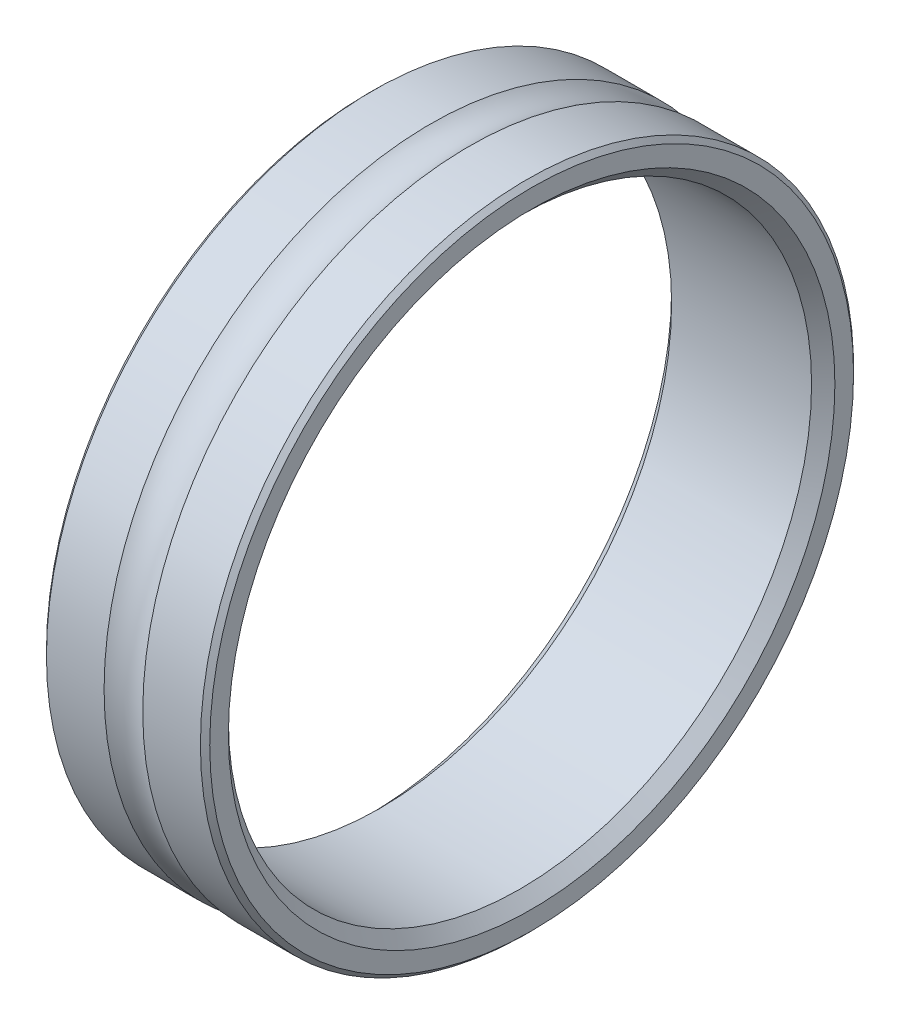
ISO-10303-21;
HEADER;
FILE_DESCRIPTION(('STEP AP214'),'2;1');
FILE_NAME('part.step','',(''),(''),'','','');
FILE_SCHEMA(('AUTOMOTIVE_DESIGN { 1 0 10303 214 1 1 1 1 }'));
ENDSEC;
DATA;
#1=APPLICATION_CONTEXT('core data for automotive mechanical design processes');
#2=APPLICATION_PROTOCOL_DEFINITION('international standard','automotive_design',2000,#1);
#3=PRODUCT_CONTEXT('',#1,'mechanical');
#4=PRODUCT('Part','Part','',(#3));
#5=PRODUCT_RELATED_PRODUCT_CATEGORY('part','',(#4));
#6=PRODUCT_DEFINITION_FORMATION('','',#4);
#7=PRODUCT_DEFINITION_CONTEXT('part definition',#1,'design');
#8=PRODUCT_DEFINITION('design','',#6,#7);
#9=PRODUCT_DEFINITION_SHAPE('','',#8);
#10=(LENGTH_UNIT() NAMED_UNIT(*) SI_UNIT(.MILLI.,.METRE.));
#11=(NAMED_UNIT(*) PLANE_ANGLE_UNIT() SI_UNIT($,.RADIAN.));
#12=(NAMED_UNIT(*) SI_UNIT($,.STERADIAN.) SOLID_ANGLE_UNIT());
#13=UNCERTAINTY_MEASURE_WITH_UNIT(LENGTH_MEASURE(1.E-05),#10,'distance_accuracy_value','');
#14=(GEOMETRIC_REPRESENTATION_CONTEXT(3) GLOBAL_UNCERTAINTY_ASSIGNED_CONTEXT((#13)) GLOBAL_UNIT_ASSIGNED_CONTEXT((#10,
#11,#12)) REPRESENTATION_CONTEXT('',''));
#15=CARTESIAN_POINT('',(0.,0.,0.));
#16=DIRECTION('',(0.,0.,1.));
#17=DIRECTION('',(1.,0.,0.));
#18=AXIS2_PLACEMENT_3D('',#15,#16,#17);
#19=CARTESIAN_POINT('',(-3.5,12.5,0.));
#20=DIRECTION('',(1.,0.,0.));
#21=DIRECTION('',(0.,0.,-1.));
#22=AXIS2_PLACEMENT_3D('',#19,#20,#21);
#23=PLANE('',#22);
#24=CARTESIAN_POINT('',(-3.5,0.,0.));
#25=DIRECTION('',(1.,0.,0.));
#26=DIRECTION('',(0.,0.,-1.));
#27=AXIS2_PLACEMENT_3D('',#24,#25,#26);
#28=CIRCLE('',#27,13.8);
#29=CARTESIAN_POINT('',(-3.5,0.,-13.8));
#30=VERTEX_POINT('',#29);
#31=EDGE_CURVE('E47',#30,#30,#28,.F.);
#32=ORIENTED_EDGE('',*,*,#31,.T.);
#33=EDGE_LOOP('',(#32));
#34=FACE_BOUND('',#33,.T.);
#35=CARTESIAN_POINT('',(-3.5,0.,0.));
#36=DIRECTION('',(1.,0.,0.));
#37=DIRECTION('',(0.,0.,-1.));
#38=AXIS2_PLACEMENT_3D('',#35,#36,#37);
#39=CIRCLE('',#38,13.);
#40=CARTESIAN_POINT('',(-3.5,0.,-13.));
#41=VERTEX_POINT('',#40);
#42=EDGE_CURVE('E55',#41,#41,#39,.T.);
#43=ORIENTED_EDGE('',*,*,#42,.T.);
#44=EDGE_LOOP('',(#43));
#45=FACE_BOUND('',#44,.T.);
#46=ADVANCED_FACE('F32',(#34,#45),#23,.F.);
#47=CARTESIAN_POINT('',(0.,0.,0.));
#48=DIRECTION('',(-1.,0.,0.));
#49=DIRECTION('',(0.,0.,1.));
#50=AXIS2_PLACEMENT_3D('',#47,#48,#49);
#51=CYLINDRICAL_SURFACE('',#50,12.5);
#52=CARTESIAN_POINT('',(-3.,0.,0.));
#53=DIRECTION('',(1.,0.,0.));
#54=DIRECTION('',(0.,0.,-1.));
#55=AXIS2_PLACEMENT_3D('',#52,#53,#54);
#56=CIRCLE('',#55,12.5);
#57=CARTESIAN_POINT('',(-3.,0.,-12.5));
#58=VERTEX_POINT('',#57);
#59=EDGE_CURVE('E58',#58,#58,#56,.F.);
#60=ORIENTED_EDGE('',*,*,#59,.T.);
#61=EDGE_LOOP('',(#60));
#62=FACE_BOUND('',#61,.T.);
#63=CARTESIAN_POINT('',(3.,0.,0.));
#64=DIRECTION('',(-1.,0.,0.));
#65=DIRECTION('',(0.,0.,1.));
#66=AXIS2_PLACEMENT_3D('',#63,#64,#65);
#67=CIRCLE('',#66,12.5);
#68=CARTESIAN_POINT('',(3.,0.,12.5));
#69=VERTEX_POINT('',#68);
#70=EDGE_CURVE('E61',#69,#69,#67,.F.);
#71=ORIENTED_EDGE('',*,*,#70,.T.);
#72=EDGE_LOOP('',(#71));
#73=FACE_BOUND('',#72,.T.);
#74=ADVANCED_FACE('F86',(#62,#73),#51,.F.);
#75=CARTESIAN_POINT('',(3.5,12.5,0.));
#76=DIRECTION('',(-1.,0.,0.));
#77=DIRECTION('',(0.,0.,1.));
#78=AXIS2_PLACEMENT_3D('',#75,#76,#77);
#79=PLANE('',#78);
#80=CARTESIAN_POINT('',(3.5,0.,0.));
#81=DIRECTION('',(-1.,0.,0.));
#82=DIRECTION('',(0.,0.,1.));
#83=AXIS2_PLACEMENT_3D('',#80,#81,#82);
#84=CIRCLE('',#83,13.8);
#85=CARTESIAN_POINT('',(3.5,0.,13.8));
#86=VERTEX_POINT('',#85);
#87=EDGE_CURVE('E10',#86,#86,#84,.F.);
#88=ORIENTED_EDGE('',*,*,#87,.T.);
#89=EDGE_LOOP('',(#88));
#90=FACE_BOUND('',#89,.T.);
#91=CARTESIAN_POINT('',(3.5,0.,0.));
#92=DIRECTION('',(-1.,0.,0.));
#93=DIRECTION('',(0.,0.,1.));
#94=AXIS2_PLACEMENT_3D('',#91,#92,#93);
#95=CIRCLE('',#94,13.);
#96=CARTESIAN_POINT('',(3.5,0.,13.));
#97=VERTEX_POINT('',#96);
#98=EDGE_CURVE('E52',#97,#97,#95,.T.);
#99=ORIENTED_EDGE('',*,*,#98,.T.);
#100=EDGE_LOOP('',(#99));
#101=FACE_BOUND('',#100,.T.);
#102=ADVANCED_FACE('F81',(#90,#101),#79,.F.);
#103=CARTESIAN_POINT('',(0.,0.,0.));
#104=DIRECTION('',(-1.,0.,0.));
#105=DIRECTION('',(0.,0.,1.));
#106=AXIS2_PLACEMENT_3D('',#103,#104,#105);
#107=CYLINDRICAL_SURFACE('',#106,14.);
#108=CARTESIAN_POINT('',(3.3,0.,0.));
#109=DIRECTION('',(-1.,0.,0.));
#110=DIRECTION('',(0.,0.,1.));
#111=AXIS2_PLACEMENT_3D('',#108,#109,#110);
#112=CIRCLE('',#111,14.);
#113=CARTESIAN_POINT('',(3.3,0.,14.));
#114=VERTEX_POINT('',#113);
#115=EDGE_CURVE('E39',#114,#114,#112,.T.);
#116=ORIENTED_EDGE('',*,*,#115,.T.);
#117=EDGE_LOOP('',(#116));
#118=FACE_BOUND('',#117,.T.);
#119=CARTESIAN_POINT('',(0.829156197588851,0.,0.));
#120=DIRECTION('',(-1.,0.,0.));
#121=DIRECTION('',(0.,0.,1.));
#122=AXIS2_PLACEMENT_3D('',#119,#120,#121);
#123=CIRCLE('',#122,14.);
#124=CARTESIAN_POINT('',(0.829156197588851,0.,14.));
#125=VERTEX_POINT('',#124);
#126=EDGE_CURVE('E64',#125,#125,#123,.T.);
#127=ORIENTED_EDGE('',*,*,#126,.F.);
#128=EDGE_LOOP('',(#127));
#129=FACE_BOUND('',#128,.T.);
#130=ADVANCED_FACE('F76',(#118,#129),#107,.T.);
#131=CARTESIAN_POINT('',(0.,0.,0.));
#132=DIRECTION('',(-1.,0.,0.));
#133=DIRECTION('',(0.,0.,1.));
#134=AXIS2_PLACEMENT_3D('',#131,#132,#133);
#135=TOROIDAL_SURFACE('',#134,15.25,1.5);
#136=CARTESIAN_POINT('',(-0.829156197588852,0.,0.));
#137=DIRECTION('',(-1.,0.,0.));
#138=DIRECTION('',(0.,0.,1.));
#139=AXIS2_PLACEMENT_3D('',#136,#137,#138);
#140=CIRCLE('',#139,14.);
#141=CARTESIAN_POINT('',(-0.829156197588852,0.,14.));
#142=VERTEX_POINT('',#141);
#143=EDGE_CURVE('E67',#142,#142,#140,.T.);
#144=ORIENTED_EDGE('',*,*,#143,.F.);
#145=EDGE_LOOP('',(#144));
#146=FACE_BOUND('',#145,.T.);
#147=ORIENTED_EDGE('',*,*,#126,.T.);
#148=EDGE_LOOP('',(#147));
#149=FACE_BOUND('',#148,.T.);
#150=ADVANCED_FACE('F73',(#146,#149),#135,.F.);
#151=CARTESIAN_POINT('',(0.,0.,0.));
#152=DIRECTION('',(-1.,0.,0.));
#153=DIRECTION('',(0.,0.,1.));
#154=AXIS2_PLACEMENT_3D('',#151,#152,#153);
#155=CYLINDRICAL_SURFACE('',#154,14.);
#156=CARTESIAN_POINT('',(-3.3,0.,0.));
#157=DIRECTION('',(1.,0.,0.));
#158=DIRECTION('',(0.,0.,-1.));
#159=AXIS2_PLACEMENT_3D('',#156,#157,#158);
#160=CIRCLE('',#159,14.);
#161=CARTESIAN_POINT('',(-3.3,0.,-14.));
#162=VERTEX_POINT('',#161);
#163=EDGE_CURVE('E43',#162,#162,#160,.T.);
#164=ORIENTED_EDGE('',*,*,#163,.T.);
#165=EDGE_LOOP('',(#164));
#166=FACE_BOUND('',#165,.T.);
#167=ORIENTED_EDGE('',*,*,#143,.T.);
#168=EDGE_LOOP('',(#167));
#169=FACE_BOUND('',#168,.T.);
#170=ADVANCED_FACE('F71',(#166,#169),#155,.T.);
#171=CARTESIAN_POINT('',(-3.,0.,0.));
#172=DIRECTION('',(-1.,0.,0.));
#173=DIRECTION('',(0.,0.,1.));
#174=AXIS2_PLACEMENT_3D('',#171,#172,#173);
#175=CONICAL_SURFACE('',#174,12.5,0.785398163397452);
#176=ORIENTED_EDGE('',*,*,#42,.F.);
#177=EDGE_LOOP('',(#176));
#178=FACE_BOUND('',#177,.T.);
#179=ORIENTED_EDGE('',*,*,#59,.F.);
#180=EDGE_LOOP('',(#179));
#181=FACE_BOUND('',#180,.T.);
#182=ADVANCED_FACE('F98',(#178,#181),#175,.F.);
#183=CARTESIAN_POINT('',(3.5,0.,0.));
#184=DIRECTION('',(1.,0.,0.));
#185=DIRECTION('',(0.,0.,-1.));
#186=AXIS2_PLACEMENT_3D('',#183,#184,#185);
#187=CONICAL_SURFACE('',#186,13.,0.785398163397448);
#188=ORIENTED_EDGE('',*,*,#70,.F.);
#189=EDGE_LOOP('',(#188));
#190=FACE_BOUND('',#189,.T.);
#191=ORIENTED_EDGE('',*,*,#98,.F.);
#192=EDGE_LOOP('',(#191));
#193=FACE_BOUND('',#192,.T.);
#194=ADVANCED_FACE('F101',(#190,#193),#187,.F.);
#195=CARTESIAN_POINT('',(-3.5,0.,0.));
#196=DIRECTION('',(1.,0.,0.));
#197=DIRECTION('',(0.,0.,-1.));
#198=AXIS2_PLACEMENT_3D('',#195,#196,#197);
#199=CONICAL_SURFACE('',#198,13.8,0.785398163397453);
#200=ORIENTED_EDGE('',*,*,#163,.F.);
#201=EDGE_LOOP('',(#200));
#202=FACE_BOUND('',#201,.T.);
#203=ORIENTED_EDGE('',*,*,#31,.F.);
#204=EDGE_LOOP('',(#203));
#205=FACE_BOUND('',#204,.T.);
#206=ADVANCED_FACE('F104',(#202,#205),#199,.T.);
#207=CARTESIAN_POINT('',(3.3,0.,0.));
#208=DIRECTION('',(-1.,0.,0.));
#209=DIRECTION('',(0.,0.,1.));
#210=AXIS2_PLACEMENT_3D('',#207,#208,#209);
#211=CONICAL_SURFACE('',#210,14.,0.785398163397457);
#212=ORIENTED_EDGE('',*,*,#87,.F.);
#213=EDGE_LOOP('',(#212));
#214=FACE_BOUND('',#213,.T.);
#215=ORIENTED_EDGE('',*,*,#115,.F.);
#216=EDGE_LOOP('',(#215));
#217=FACE_BOUND('',#216,.T.);
#218=ADVANCED_FACE('F34',(#214,#217),#211,.T.);
#219=CLOSED_SHELL('',(#46,#74,#102,#130,#150,#170,#182,#194,#206,#218));
#220=MANIFOLD_SOLID_BREP('B2',#219);
#221=ADVANCED_BREP_SHAPE_REPRESENTATION('',(#18,#220),#14);
#222=SHAPE_DEFINITION_REPRESENTATION(#9,#221);
ENDSEC;
END-ISO-10303-21;
